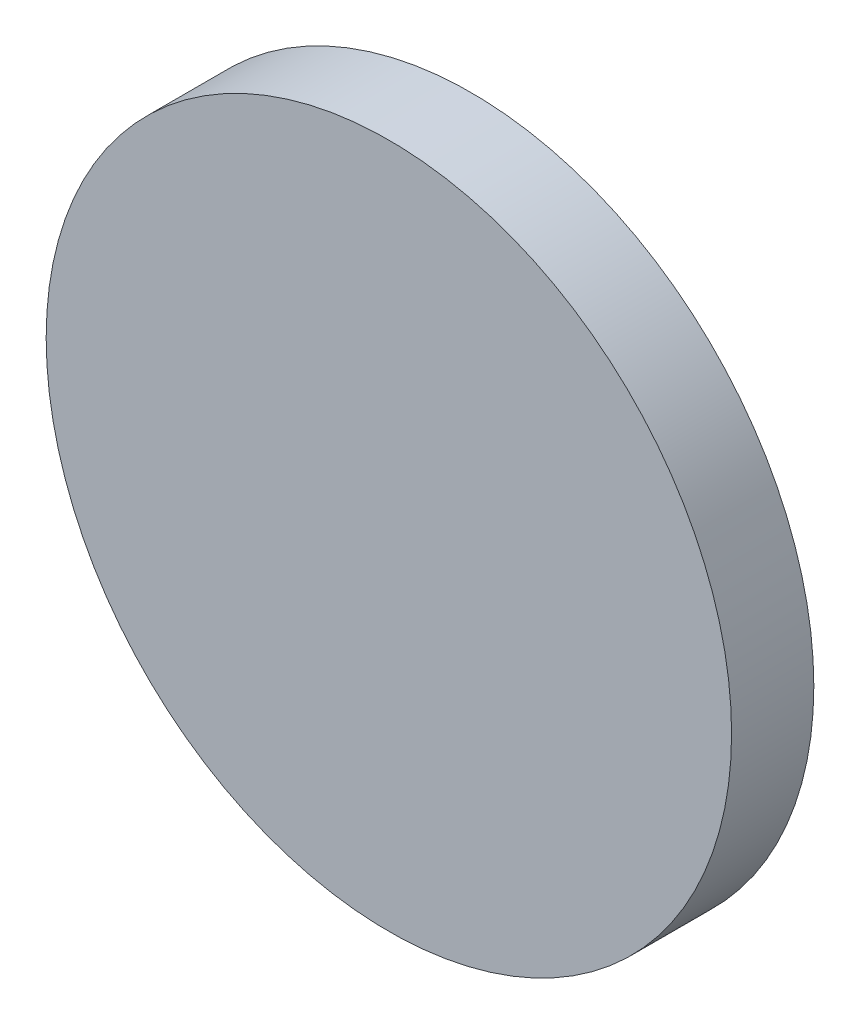
ISO-10303-21;
HEADER;
FILE_DESCRIPTION(('STEP AP214'),'2;1');
FILE_NAME('part.step','',(''),(''),'','','');
FILE_SCHEMA(('AUTOMOTIVE_DESIGN { 1 0 10303 214 1 1 1 1 }'));
ENDSEC;
DATA;
#1=APPLICATION_CONTEXT('core data for automotive mechanical design processes');
#2=APPLICATION_PROTOCOL_DEFINITION('international standard','automotive_design',2000,#1);
#3=PRODUCT_CONTEXT('',#1,'mechanical');
#4=PRODUCT('Part','Part','',(#3));
#5=PRODUCT_RELATED_PRODUCT_CATEGORY('part','',(#4));
#6=PRODUCT_DEFINITION_FORMATION('','',#4);
#7=PRODUCT_DEFINITION_CONTEXT('part definition',#1,'design');
#8=PRODUCT_DEFINITION('design','',#6,#7);
#9=PRODUCT_DEFINITION_SHAPE('','',#8);
#10=(LENGTH_UNIT() NAMED_UNIT(*) SI_UNIT(.MILLI.,.METRE.));
#11=(NAMED_UNIT(*) PLANE_ANGLE_UNIT() SI_UNIT($,.RADIAN.));
#12=(NAMED_UNIT(*) SI_UNIT($,.STERADIAN.) SOLID_ANGLE_UNIT());
#13=UNCERTAINTY_MEASURE_WITH_UNIT(LENGTH_MEASURE(1.E-05),#10,'distance_accuracy_value','');
#14=(GEOMETRIC_REPRESENTATION_CONTEXT(3) GLOBAL_UNCERTAINTY_ASSIGNED_CONTEXT((#13)) GLOBAL_UNIT_ASSIGNED_CONTEXT((#10,
#11,#12)) REPRESENTATION_CONTEXT('',''));
#15=CARTESIAN_POINT('',(0.,0.,0.));
#16=DIRECTION('',(0.,0.,1.));
#17=DIRECTION('',(1.,0.,0.));
#18=AXIS2_PLACEMENT_3D('',#15,#16,#17);
#19=CARTESIAN_POINT('',(0.,0.,3.));
#20=DIRECTION('',(0.,0.,-1.));
#21=DIRECTION('',(-1.,0.,0.));
#22=AXIS2_PLACEMENT_3D('',#19,#20,#21);
#23=CYLINDRICAL_SURFACE('',#22,12.5);
#24=CARTESIAN_POINT('',(0.,0.,3.));
#25=DIRECTION('',(0.,0.,1.));
#26=DIRECTION('',(1.,0.,0.));
#27=AXIS2_PLACEMENT_3D('',#24,#25,#26);
#28=CIRCLE('',#27,12.5);
#29=CARTESIAN_POINT('',(12.5,0.,3.));
#30=VERTEX_POINT('',#29);
#31=EDGE_CURVE('E10',#30,#30,#28,.T.);
#32=ORIENTED_EDGE('',*,*,#31,.F.);
#33=EDGE_LOOP('',(#32));
#34=FACE_BOUND('',#33,.T.);
#35=CARTESIAN_POINT('',(0.,0.,0.));
#36=DIRECTION('',(0.,0.,1.));
#37=DIRECTION('',(1.,0.,0.));
#38=AXIS2_PLACEMENT_3D('',#35,#36,#37);
#39=CIRCLE('',#38,12.5);
#40=CARTESIAN_POINT('',(12.5,0.,0.));
#41=VERTEX_POINT('',#40);
#42=EDGE_CURVE('E40',#41,#41,#39,.T.);
#43=ORIENTED_EDGE('',*,*,#42,.T.);
#44=EDGE_LOOP('',(#43));
#45=FACE_BOUND('',#44,.T.);
#46=ADVANCED_FACE('F37',(#34,#45),#23,.T.);
#47=CARTESIAN_POINT('',(0.,0.,3.));
#48=DIRECTION('',(0.,0.,1.));
#49=DIRECTION('',(1.,0.,0.));
#50=AXIS2_PLACEMENT_3D('',#47,#48,#49);
#51=PLANE('',#50);
#52=ORIENTED_EDGE('',*,*,#31,.T.);
#53=EDGE_LOOP('',(#52));
#54=FACE_BOUND('',#53,.T.);
#55=ADVANCED_FACE('F54',(#54),#51,.T.);
#56=CARTESIAN_POINT('',(0.,0.,0.));
#57=DIRECTION('',(0.,0.,1.));
#58=DIRECTION('',(1.,0.,0.));
#59=AXIS2_PLACEMENT_3D('',#56,#57,#58);
#60=PLANE('',#59);
#61=ORIENTED_EDGE('',*,*,#42,.F.);
#62=EDGE_LOOP('',(#61));
#63=FACE_BOUND('',#62,.T.);
#64=ADVANCED_FACE('F52',(#63),#60,.F.);
#65=CLOSED_SHELL('',(#46,#55,#64));
#66=MANIFOLD_SOLID_BREP('B2',#65);
#67=ADVANCED_BREP_SHAPE_REPRESENTATION('',(#18,#66),#14);
#68=SHAPE_DEFINITION_REPRESENTATION(#9,#67);
ENDSEC;
END-ISO-10303-21;
